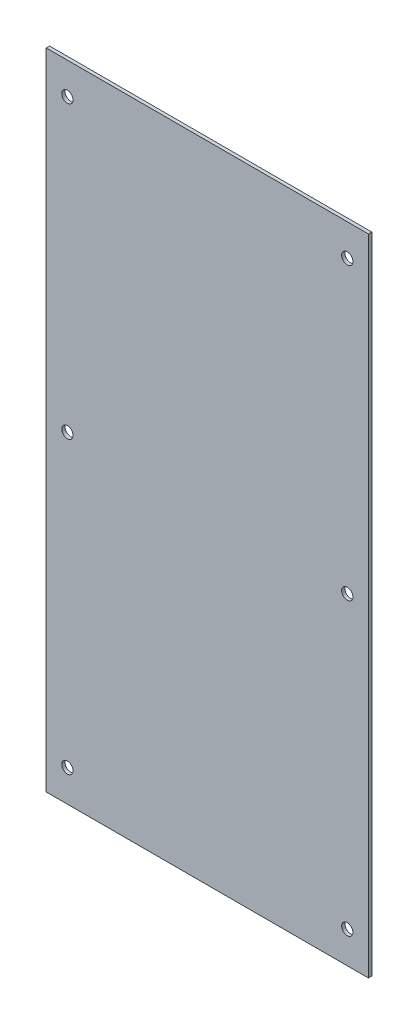
ISO-10303-21;
HEADER;
FILE_DESCRIPTION(('STEP AP214'),'2;1');
FILE_NAME('part.step','',(''),(''),'','','');
FILE_SCHEMA(('AUTOMOTIVE_DESIGN { 1 0 10303 214 1 1 1 1 }'));
ENDSEC;
DATA;
#1=APPLICATION_CONTEXT('core data for automotive mechanical design processes');
#2=APPLICATION_PROTOCOL_DEFINITION('international standard','automotive_design',2000,#1);
#3=PRODUCT_CONTEXT('',#1,'mechanical');
#4=PRODUCT('Part','Part','',(#3));
#5=PRODUCT_RELATED_PRODUCT_CATEGORY('part','',(#4));
#6=PRODUCT_DEFINITION_FORMATION('','',#4);
#7=PRODUCT_DEFINITION_CONTEXT('part definition',#1,'design');
#8=PRODUCT_DEFINITION('design','',#6,#7);
#9=PRODUCT_DEFINITION_SHAPE('','',#8);
#10=(LENGTH_UNIT() NAMED_UNIT(*) SI_UNIT(.MILLI.,.METRE.));
#11=(NAMED_UNIT(*) PLANE_ANGLE_UNIT() SI_UNIT($,.RADIAN.));
#12=(NAMED_UNIT(*) SI_UNIT($,.STERADIAN.) SOLID_ANGLE_UNIT());
#13=UNCERTAINTY_MEASURE_WITH_UNIT(LENGTH_MEASURE(1.E-05),#10,'distance_accuracy_value','');
#14=(GEOMETRIC_REPRESENTATION_CONTEXT(3) GLOBAL_UNCERTAINTY_ASSIGNED_CONTEXT((#13)) GLOBAL_UNIT_ASSIGNED_CONTEXT((#10,
#11,#12)) REPRESENTATION_CONTEXT('',''));
#15=CARTESIAN_POINT('',(0.,0.,0.));
#16=DIRECTION('',(0.,0.,1.));
#17=DIRECTION('',(1.,0.,0.));
#18=AXIS2_PLACEMENT_3D('',#15,#16,#17);
#19=CARTESIAN_POINT('',(76.1999999999999,-152.4,1.5748));
#20=DIRECTION('',(-1.,0.,0.));
#21=DIRECTION('',(0.,0.,1.));
#22=AXIS2_PLACEMENT_3D('',#19,#20,#21);
#23=PLANE('',#22);
#24=DIRECTION('',(0.,1.,0.));
#25=VECTOR('',#24,1.);
#26=CARTESIAN_POINT('',(76.1999999999999,-152.4,0.));
#27=LINE('',#26,#25);
#28=CARTESIAN_POINT('',(76.1999999999999,-152.4,0.));
#29=VERTEX_POINT('',#28);
#30=CARTESIAN_POINT('',(76.1999999999999,152.4,0.));
#31=VERTEX_POINT('',#30);
#32=EDGE_CURVE('E102',#29,#31,#27,.T.);
#33=ORIENTED_EDGE('',*,*,#32,.T.);
#34=DIRECTION('',(0.,0.,-1.));
#35=VECTOR('',#34,1.);
#36=CARTESIAN_POINT('',(76.1999999999999,152.4,1.5748));
#37=LINE('',#36,#35);
#38=CARTESIAN_POINT('',(76.1999999999999,152.4,1.5748));
#39=VERTEX_POINT('',#38);
#40=EDGE_CURVE('E11',#39,#31,#37,.T.);
#41=ORIENTED_EDGE('',*,*,#40,.F.);
#42=DIRECTION('',(0.,1.,0.));
#43=VECTOR('',#42,1.);
#44=CARTESIAN_POINT('',(76.1999999999999,-152.4,1.5748));
#45=LINE('',#44,#43);
#46=CARTESIAN_POINT('',(76.1999999999999,-152.4,1.5748));
#47=VERTEX_POINT('',#46);
#48=EDGE_CURVE('E90',#47,#39,#45,.T.);
#49=ORIENTED_EDGE('',*,*,#48,.F.);
#50=DIRECTION('',(0.,0.,-1.));
#51=VECTOR('',#50,1.);
#52=CARTESIAN_POINT('',(76.1999999999999,-152.4,1.5748));
#53=LINE('',#52,#51);
#54=EDGE_CURVE('E98',#47,#29,#53,.T.);
#55=ORIENTED_EDGE('',*,*,#54,.T.);
#56=EDGE_LOOP('',(#33,#41,#49,#55));
#57=FACE_BOUND('',#56,.T.);
#58=ADVANCED_FACE('F39',(#57),#23,.F.);
#59=CARTESIAN_POINT('',(-76.2000000000001,152.4,1.5748));
#60=DIRECTION('',(0.,-1.,0.));
#61=DIRECTION('',(0.,0.,-1.));
#62=AXIS2_PLACEMENT_3D('',#59,#60,#61);
#63=PLANE('',#62);
#64=DIRECTION('',(-1.,0.,0.));
#65=VECTOR('',#64,1.);
#66=CARTESIAN_POINT('',(-76.2000000000001,152.4,0.));
#67=LINE('',#66,#65);
#68=CARTESIAN_POINT('',(-76.2000000000001,152.4,0.));
#69=VERTEX_POINT('',#68);
#70=EDGE_CURVE('E94',#31,#69,#67,.T.);
#71=ORIENTED_EDGE('',*,*,#70,.T.);
#72=DIRECTION('',(0.,0.,-1.));
#73=VECTOR('',#72,1.);
#74=CARTESIAN_POINT('',(-76.2000000000001,152.4,1.5748));
#75=LINE('',#74,#73);
#76=CARTESIAN_POINT('',(-76.2000000000001,152.4,1.5748));
#77=VERTEX_POINT('',#76);
#78=EDGE_CURVE('E47',#77,#69,#75,.T.);
#79=ORIENTED_EDGE('',*,*,#78,.F.);
#80=DIRECTION('',(-1.,0.,0.));
#81=VECTOR('',#80,1.);
#82=CARTESIAN_POINT('',(-76.2000000000001,152.4,1.5748));
#83=LINE('',#82,#81);
#84=EDGE_CURVE('E85',#39,#77,#83,.T.);
#85=ORIENTED_EDGE('',*,*,#84,.F.);
#86=ORIENTED_EDGE('',*,*,#40,.T.);
#87=EDGE_LOOP('',(#71,#79,#85,#86));
#88=FACE_BOUND('',#87,.T.);
#89=ADVANCED_FACE('F93',(#88),#63,.F.);
#90=CARTESIAN_POINT('',(-76.2000000000001,-152.4,1.5748));
#91=DIRECTION('',(1.,0.,0.));
#92=DIRECTION('',(0.,0.,-1.));
#93=AXIS2_PLACEMENT_3D('',#90,#91,#92);
#94=PLANE('',#93);
#95=DIRECTION('',(0.,-1.,0.));
#96=VECTOR('',#95,1.);
#97=CARTESIAN_POINT('',(-76.2000000000001,-152.4,0.));
#98=LINE('',#97,#96);
#99=CARTESIAN_POINT('',(-76.2000000000001,-152.4,0.));
#100=VERTEX_POINT('',#99);
#101=EDGE_CURVE('E72',#69,#100,#98,.T.);
#102=ORIENTED_EDGE('',*,*,#101,.T.);
#103=DIRECTION('',(0.,0.,-1.));
#104=VECTOR('',#103,1.);
#105=CARTESIAN_POINT('',(-76.2000000000001,-152.4,1.5748));
#106=LINE('',#105,#104);
#107=CARTESIAN_POINT('',(-76.2000000000001,-152.4,1.5748));
#108=VERTEX_POINT('',#107);
#109=EDGE_CURVE('E95',#108,#100,#106,.T.);
#110=ORIENTED_EDGE('',*,*,#109,.F.);
#111=DIRECTION('',(0.,-1.,0.));
#112=VECTOR('',#111,1.);
#113=CARTESIAN_POINT('',(-76.2000000000001,-152.4,1.5748));
#114=LINE('',#113,#112);
#115=EDGE_CURVE('E88',#77,#108,#114,.T.);
#116=ORIENTED_EDGE('',*,*,#115,.F.);
#117=ORIENTED_EDGE('',*,*,#78,.T.);
#118=EDGE_LOOP('',(#102,#110,#116,#117));
#119=FACE_BOUND('',#118,.T.);
#120=ADVANCED_FACE('F96',(#119),#94,.F.);
#121=CARTESIAN_POINT('',(-76.2000000000001,-152.4,1.5748));
#122=DIRECTION('',(0.,1.,0.));
#123=DIRECTION('',(0.,0.,1.));
#124=AXIS2_PLACEMENT_3D('',#121,#122,#123);
#125=PLANE('',#124);
#126=DIRECTION('',(1.,0.,0.));
#127=VECTOR('',#126,1.);
#128=CARTESIAN_POINT('',(-76.2000000000001,-152.4,0.));
#129=LINE('',#128,#127);
#130=EDGE_CURVE('E78',#100,#29,#129,.T.);
#131=ORIENTED_EDGE('',*,*,#130,.T.);
#132=ORIENTED_EDGE('',*,*,#54,.F.);
#133=DIRECTION('',(1.,0.,0.));
#134=VECTOR('',#133,1.);
#135=CARTESIAN_POINT('',(-76.2000000000001,-152.4,1.5748));
#136=LINE('',#135,#134);
#137=EDGE_CURVE('E55',#108,#47,#136,.T.);
#138=ORIENTED_EDGE('',*,*,#137,.F.);
#139=ORIENTED_EDGE('',*,*,#109,.T.);
#140=EDGE_LOOP('',(#131,#132,#138,#139));
#141=FACE_BOUND('',#140,.T.);
#142=ADVANCED_FACE('F110',(#141),#125,.F.);
#143=CARTESIAN_POINT('',(0.,0.,1.5748));
#144=DIRECTION('',(0.,0.,-1.));
#145=DIRECTION('',(-1.,0.,0.));
#146=AXIS2_PLACEMENT_3D('',#143,#144,#145);
#147=PLANE('',#146);
#148=CARTESIAN_POINT('',(-66.1999999999998,137.4,1.5748));
#149=DIRECTION('',(0.,0.,-1.));
#150=DIRECTION('',(-1.,0.,0.));
#151=AXIS2_PLACEMENT_3D('',#148,#149,#150);
#152=CIRCLE('',#151,2.665);
#153=CARTESIAN_POINT('',(-68.8649999999998,137.4,1.5748));
#154=VERTEX_POINT('',#153);
#155=EDGE_CURVE('E122',#154,#154,#152,.F.);
#156=ORIENTED_EDGE('',*,*,#155,.F.);
#157=EDGE_LOOP('',(#156));
#158=FACE_BOUND('',#157,.T.);
#159=CARTESIAN_POINT('',(-66.2,1.00094910487859E-13,1.5748));
#160=DIRECTION('',(0.,0.,-1.));
#161=DIRECTION('',(-1.,0.,0.));
#162=AXIS2_PLACEMENT_3D('',#159,#160,#161);
#163=CIRCLE('',#162,2.665);
#164=CARTESIAN_POINT('',(-68.865,1.00094910487859E-13,1.5748));
#165=VERTEX_POINT('',#164);
#166=EDGE_CURVE('E129',#165,#165,#163,.F.);
#167=ORIENTED_EDGE('',*,*,#166,.F.);
#168=EDGE_LOOP('',(#167));
#169=FACE_BOUND('',#168,.T.);
#170=CARTESIAN_POINT('',(-66.1999999999999,-137.4,1.5748));
#171=DIRECTION('',(0.,0.,-1.));
#172=DIRECTION('',(-1.,0.,0.));
#173=AXIS2_PLACEMENT_3D('',#170,#171,#172);
#174=CIRCLE('',#173,2.665);
#175=CARTESIAN_POINT('',(-68.8649999999999,-137.4,1.5748));
#176=VERTEX_POINT('',#175);
#177=EDGE_CURVE('E135',#176,#176,#174,.F.);
#178=ORIENTED_EDGE('',*,*,#177,.F.);
#179=EDGE_LOOP('',(#178));
#180=FACE_BOUND('',#179,.T.);
#181=CARTESIAN_POINT('',(66.2,0.,1.5748));
#182=DIRECTION('',(0.,0.,-1.));
#183=DIRECTION('',(-1.,0.,0.));
#184=AXIS2_PLACEMENT_3D('',#181,#182,#183);
#185=CIRCLE('',#184,2.665);
#186=CARTESIAN_POINT('',(63.535,0.,1.5748));
#187=VERTEX_POINT('',#186);
#188=EDGE_CURVE('E141',#187,#187,#185,.F.);
#189=ORIENTED_EDGE('',*,*,#188,.F.);
#190=EDGE_LOOP('',(#189));
#191=FACE_BOUND('',#190,.T.);
#192=CARTESIAN_POINT('',(66.1999999999998,-137.4,1.5748));
#193=DIRECTION('',(0.,0.,-1.));
#194=DIRECTION('',(-1.,0.,0.));
#195=AXIS2_PLACEMENT_3D('',#192,#193,#194);
#196=CIRCLE('',#195,2.665);
#197=CARTESIAN_POINT('',(63.5349999999998,-137.4,1.5748));
#198=VERTEX_POINT('',#197);
#199=EDGE_CURVE('E121',#198,#198,#196,.F.);
#200=ORIENTED_EDGE('',*,*,#199,.F.);
#201=EDGE_LOOP('',(#200));
#202=FACE_BOUND('',#201,.T.);
#203=CARTESIAN_POINT('',(66.2,137.4,1.5748));
#204=DIRECTION('',(0.,0.,-1.));
#205=DIRECTION('',(-1.,0.,0.));
#206=AXIS2_PLACEMENT_3D('',#203,#204,#205);
#207=CIRCLE('',#206,2.665);
#208=CARTESIAN_POINT('',(63.535,137.4,1.5748));
#209=VERTEX_POINT('',#208);
#210=EDGE_CURVE('E105',#209,#209,#207,.F.);
#211=ORIENTED_EDGE('',*,*,#210,.F.);
#212=EDGE_LOOP('',(#211));
#213=FACE_BOUND('',#212,.T.);
#214=ORIENTED_EDGE('',*,*,#48,.T.);
#215=ORIENTED_EDGE('',*,*,#84,.T.);
#216=ORIENTED_EDGE('',*,*,#115,.T.);
#217=ORIENTED_EDGE('',*,*,#137,.T.);
#218=EDGE_LOOP('',(#214,#215,#216,#217));
#219=FACE_BOUND('',#218,.T.);
#220=ADVANCED_FACE('F86',(#158,#169,#180,#191,#202,#213,#219),#147,.F.);
#221=CARTESIAN_POINT('',(0.,0.,0.));
#222=DIRECTION('',(0.,0.,-1.));
#223=DIRECTION('',(-1.,0.,0.));
#224=AXIS2_PLACEMENT_3D('',#221,#222,#223);
#225=PLANE('',#224);
#226=CARTESIAN_POINT('',(-66.1999999999998,137.4,0.));
#227=DIRECTION('',(0.,0.,-1.));
#228=DIRECTION('',(1.,0.,0.));
#229=AXIS2_PLACEMENT_3D('',#226,#227,#228);
#230=CIRCLE('',#229,2.665);
#231=CARTESIAN_POINT('',(-63.5349999999998,137.4,0.));
#232=VERTEX_POINT('',#231);
#233=EDGE_CURVE('E126',#232,#232,#230,.T.);
#234=ORIENTED_EDGE('',*,*,#233,.F.);
#235=EDGE_LOOP('',(#234));
#236=FACE_BOUND('',#235,.T.);
#237=CARTESIAN_POINT('',(-66.2,1.00094910487859E-13,0.));
#238=DIRECTION('',(0.,0.,-1.));
#239=DIRECTION('',(1.,0.,0.));
#240=AXIS2_PLACEMENT_3D('',#237,#238,#239);
#241=CIRCLE('',#240,2.665);
#242=CARTESIAN_POINT('',(-63.535,1.00094910487859E-13,0.));
#243=VERTEX_POINT('',#242);
#244=EDGE_CURVE('E125',#243,#243,#241,.T.);
#245=ORIENTED_EDGE('',*,*,#244,.F.);
#246=EDGE_LOOP('',(#245));
#247=FACE_BOUND('',#246,.T.);
#248=CARTESIAN_POINT('',(-66.1999999999999,-137.4,0.));
#249=DIRECTION('',(0.,0.,-1.));
#250=DIRECTION('',(-1.,0.,0.));
#251=AXIS2_PLACEMENT_3D('',#248,#249,#250);
#252=CIRCLE('',#251,2.665);
#253=CARTESIAN_POINT('',(-68.8649999999999,-137.4,0.));
#254=VERTEX_POINT('',#253);
#255=EDGE_CURVE('E132',#254,#254,#252,.T.);
#256=ORIENTED_EDGE('',*,*,#255,.F.);
#257=EDGE_LOOP('',(#256));
#258=FACE_BOUND('',#257,.T.);
#259=CARTESIAN_POINT('',(66.2,0.,0.));
#260=DIRECTION('',(0.,0.,-1.));
#261=DIRECTION('',(-1.,0.,0.));
#262=AXIS2_PLACEMENT_3D('',#259,#260,#261);
#263=CIRCLE('',#262,2.665);
#264=CARTESIAN_POINT('',(63.535,0.,0.));
#265=VERTEX_POINT('',#264);
#266=EDGE_CURVE('E138',#265,#265,#263,.T.);
#267=ORIENTED_EDGE('',*,*,#266,.F.);
#268=EDGE_LOOP('',(#267));
#269=FACE_BOUND('',#268,.T.);
#270=CARTESIAN_POINT('',(66.1999999999998,-137.4,0.));
#271=DIRECTION('',(0.,0.,-1.));
#272=DIRECTION('',(1.,0.,0.));
#273=AXIS2_PLACEMENT_3D('',#270,#271,#272);
#274=CIRCLE('',#273,2.665);
#275=CARTESIAN_POINT('',(68.8649999999998,-137.4,0.));
#276=VERTEX_POINT('',#275);
#277=EDGE_CURVE('E144',#276,#276,#274,.T.);
#278=ORIENTED_EDGE('',*,*,#277,.F.);
#279=EDGE_LOOP('',(#278));
#280=FACE_BOUND('',#279,.T.);
#281=CARTESIAN_POINT('',(66.2,137.4,0.));
#282=DIRECTION('',(0.,0.,-1.));
#283=DIRECTION('',(-1.,0.,0.));
#284=AXIS2_PLACEMENT_3D('',#281,#282,#283);
#285=CIRCLE('',#284,2.665);
#286=CARTESIAN_POINT('',(63.535,137.4,0.));
#287=VERTEX_POINT('',#286);
#288=EDGE_CURVE('E118',#287,#287,#285,.T.);
#289=ORIENTED_EDGE('',*,*,#288,.F.);
#290=EDGE_LOOP('',(#289));
#291=FACE_BOUND('',#290,.T.);
#292=ORIENTED_EDGE('',*,*,#32,.F.);
#293=ORIENTED_EDGE('',*,*,#130,.F.);
#294=ORIENTED_EDGE('',*,*,#101,.F.);
#295=ORIENTED_EDGE('',*,*,#70,.F.);
#296=EDGE_LOOP('',(#292,#293,#294,#295));
#297=FACE_BOUND('',#296,.T.);
#298=ADVANCED_FACE('F113',(#236,#247,#258,#269,#280,#291,#297),#225,.T.);
#299=CARTESIAN_POINT('',(66.2,137.4,1.5758));
#300=DIRECTION('',(0.,0.,-1.));
#301=DIRECTION('',(-1.,0.,0.));
#302=AXIS2_PLACEMENT_3D('',#299,#300,#301);
#303=CYLINDRICAL_SURFACE('',#302,2.665);
#304=ORIENTED_EDGE('',*,*,#288,.T.);
#305=EDGE_LOOP('',(#304));
#306=FACE_BOUND('',#305,.T.);
#307=ORIENTED_EDGE('',*,*,#210,.T.);
#308=EDGE_LOOP('',(#307));
#309=FACE_BOUND('',#308,.T.);
#310=ADVANCED_FACE('F157',(#306,#309),#303,.F.);
#311=CARTESIAN_POINT('',(66.1999999999998,-137.4,1.5758));
#312=DIRECTION('',(0.,0.,-1.));
#313=DIRECTION('',(-1.,0.,0.));
#314=AXIS2_PLACEMENT_3D('',#311,#312,#313);
#315=CYLINDRICAL_SURFACE('',#314,2.665);
#316=ORIENTED_EDGE('',*,*,#277,.T.);
#317=EDGE_LOOP('',(#316));
#318=FACE_BOUND('',#317,.T.);
#319=ORIENTED_EDGE('',*,*,#199,.T.);
#320=EDGE_LOOP('',(#319));
#321=FACE_BOUND('',#320,.T.);
#322=ADVANCED_FACE('F152',(#318,#321),#315,.F.);
#323=CARTESIAN_POINT('',(66.2,0.,1.5758));
#324=DIRECTION('',(0.,0.,-1.));
#325=DIRECTION('',(-1.,0.,0.));
#326=AXIS2_PLACEMENT_3D('',#323,#324,#325);
#327=CYLINDRICAL_SURFACE('',#326,2.665);
#328=ORIENTED_EDGE('',*,*,#266,.T.);
#329=EDGE_LOOP('',(#328));
#330=FACE_BOUND('',#329,.T.);
#331=ORIENTED_EDGE('',*,*,#188,.T.);
#332=EDGE_LOOP('',(#331));
#333=FACE_BOUND('',#332,.T.);
#334=ADVANCED_FACE('F212',(#330,#333),#327,.F.);
#335=CARTESIAN_POINT('',(-66.1999999999999,-137.4,1.5758));
#336=DIRECTION('',(0.,0.,-1.));
#337=DIRECTION('',(-1.,0.,0.));
#338=AXIS2_PLACEMENT_3D('',#335,#336,#337);
#339=CYLINDRICAL_SURFACE('',#338,2.665);
#340=ORIENTED_EDGE('',*,*,#255,.T.);
#341=EDGE_LOOP('',(#340));
#342=FACE_BOUND('',#341,.T.);
#343=ORIENTED_EDGE('',*,*,#177,.T.);
#344=EDGE_LOOP('',(#343));
#345=FACE_BOUND('',#344,.T.);
#346=ADVANCED_FACE('F219',(#342,#345),#339,.F.);
#347=CARTESIAN_POINT('',(-66.2,1.00094910487859E-13,1.5758));
#348=DIRECTION('',(0.,0.,-1.));
#349=DIRECTION('',(-1.,0.,0.));
#350=AXIS2_PLACEMENT_3D('',#347,#348,#349);
#351=CYLINDRICAL_SURFACE('',#350,2.665);
#352=ORIENTED_EDGE('',*,*,#244,.T.);
#353=EDGE_LOOP('',(#352));
#354=FACE_BOUND('',#353,.T.);
#355=ORIENTED_EDGE('',*,*,#166,.T.);
#356=EDGE_LOOP('',(#355));
#357=FACE_BOUND('',#356,.T.);
#358=ADVANCED_FACE('F227',(#354,#357),#351,.F.);
#359=CARTESIAN_POINT('',(-66.1999999999998,137.4,1.5758));
#360=DIRECTION('',(0.,0.,-1.));
#361=DIRECTION('',(-1.,0.,0.));
#362=AXIS2_PLACEMENT_3D('',#359,#360,#361);
#363=CYLINDRICAL_SURFACE('',#362,2.665);
#364=ORIENTED_EDGE('',*,*,#233,.T.);
#365=EDGE_LOOP('',(#364));
#366=FACE_BOUND('',#365,.T.);
#367=ORIENTED_EDGE('',*,*,#155,.T.);
#368=EDGE_LOOP('',(#367));
#369=FACE_BOUND('',#368,.T.);
#370=ADVANCED_FACE('F235',(#366,#369),#363,.F.);
#371=CLOSED_SHELL('',(#58,#89,#120,#142,#220,#298,#310,#322,#334,#346,#358,#370));
#372=MANIFOLD_SOLID_BREP('B2',#371);
#373=ADVANCED_BREP_SHAPE_REPRESENTATION('',(#18,#372),#14);
#374=SHAPE_DEFINITION_REPRESENTATION(#9,#373);
ENDSEC;
END-ISO-10303-21;
